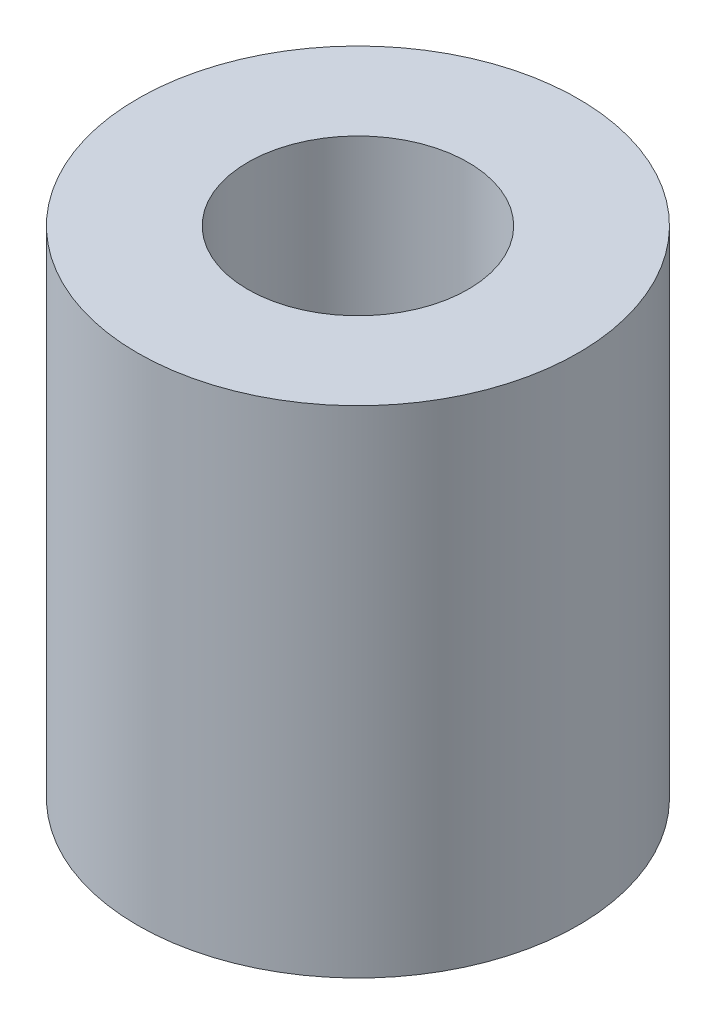
ISO-10303-21;
HEADER;
FILE_DESCRIPTION(('STEP AP214'),'2;1');
FILE_NAME('part.step','',(''),(''),'','','');
FILE_SCHEMA(('AUTOMOTIVE_DESIGN { 1 0 10303 214 1 1 1 1 }'));
ENDSEC;
DATA;
#1=APPLICATION_CONTEXT('core data for automotive mechanical design processes');
#2=APPLICATION_PROTOCOL_DEFINITION('international standard','automotive_design',2000,#1);
#3=PRODUCT_CONTEXT('',#1,'mechanical');
#4=PRODUCT('Part','Part','',(#3));
#5=PRODUCT_RELATED_PRODUCT_CATEGORY('part','',(#4));
#6=PRODUCT_DEFINITION_FORMATION('','',#4);
#7=PRODUCT_DEFINITION_CONTEXT('part definition',#1,'design');
#8=PRODUCT_DEFINITION('design','',#6,#7);
#9=PRODUCT_DEFINITION_SHAPE('','',#8);
#10=(LENGTH_UNIT() NAMED_UNIT(*) SI_UNIT(.MILLI.,.METRE.));
#11=(NAMED_UNIT(*) PLANE_ANGLE_UNIT() SI_UNIT($,.RADIAN.));
#12=(NAMED_UNIT(*) SI_UNIT($,.STERADIAN.) SOLID_ANGLE_UNIT());
#13=UNCERTAINTY_MEASURE_WITH_UNIT(LENGTH_MEASURE(1.E-05),#10,'distance_accuracy_value','');
#14=(GEOMETRIC_REPRESENTATION_CONTEXT(3) GLOBAL_UNCERTAINTY_ASSIGNED_CONTEXT((#13)) GLOBAL_UNIT_ASSIGNED_CONTEXT((#10,
#11,#12)) REPRESENTATION_CONTEXT('',''));
#15=CARTESIAN_POINT('',(0.,0.,0.));
#16=DIRECTION('',(0.,0.,1.));
#17=DIRECTION('',(1.,0.,0.));
#18=AXIS2_PLACEMENT_3D('',#15,#16,#17);
#19=CARTESIAN_POINT('',(0.,14.2875,0.));
#20=DIRECTION('',(0.,-1.,0.));
#21=DIRECTION('',(0.,0.,-1.));
#22=AXIS2_PLACEMENT_3D('',#19,#20,#21);
#23=CYLINDRICAL_SURFACE('',#22,6.35);
#24=CARTESIAN_POINT('',(0.,14.2875,0.));
#25=DIRECTION('',(0.,1.,0.));
#26=DIRECTION('',(0.,0.,1.));
#27=AXIS2_PLACEMENT_3D('',#24,#25,#26);
#28=CIRCLE('',#27,6.35);
#29=CARTESIAN_POINT('',(0.,14.2875,6.35));
#30=VERTEX_POINT('',#29);
#31=EDGE_CURVE('E10',#30,#30,#28,.T.);
#32=ORIENTED_EDGE('',*,*,#31,.F.);
#33=EDGE_LOOP('',(#32));
#34=FACE_BOUND('',#33,.T.);
#35=CARTESIAN_POINT('',(0.,0.,0.));
#36=DIRECTION('',(0.,1.,0.));
#37=DIRECTION('',(0.,0.,1.));
#38=AXIS2_PLACEMENT_3D('',#35,#36,#37);
#39=CIRCLE('',#38,6.35);
#40=CARTESIAN_POINT('',(0.,0.,6.35));
#41=VERTEX_POINT('',#40);
#42=EDGE_CURVE('E45',#41,#41,#39,.T.);
#43=ORIENTED_EDGE('',*,*,#42,.T.);
#44=EDGE_LOOP('',(#43));
#45=FACE_BOUND('',#44,.T.);
#46=ADVANCED_FACE('F37',(#34,#45),#23,.T.);
#47=CARTESIAN_POINT('',(0.,14.2875,0.));
#48=DIRECTION('',(0.,1.,0.));
#49=DIRECTION('',(0.,0.,1.));
#50=AXIS2_PLACEMENT_3D('',#47,#48,#49);
#51=PLANE('',#50);
#52=CARTESIAN_POINT('',(0.,14.2875,0.));
#53=DIRECTION('',(0.,1.,0.));
#54=DIRECTION('',(0.,0.,1.));
#55=AXIS2_PLACEMENT_3D('',#52,#53,#54);
#56=CIRCLE('',#55,3.175);
#57=CARTESIAN_POINT('',(0.,14.2875,3.175));
#58=VERTEX_POINT('',#57);
#59=EDGE_CURVE('E52',#58,#58,#56,.T.);
#60=ORIENTED_EDGE('',*,*,#59,.F.);
#61=EDGE_LOOP('',(#60));
#62=FACE_BOUND('',#61,.T.);
#63=ORIENTED_EDGE('',*,*,#31,.T.);
#64=EDGE_LOOP('',(#63));
#65=FACE_BOUND('',#64,.T.);
#66=ADVANCED_FACE('F70',(#62,#65),#51,.T.);
#67=CARTESIAN_POINT('',(0.,0.,0.));
#68=DIRECTION('',(0.,1.,0.));
#69=DIRECTION('',(0.,0.,1.));
#70=AXIS2_PLACEMENT_3D('',#67,#68,#69);
#71=PLANE('',#70);
#72=CARTESIAN_POINT('',(0.,0.,0.));
#73=DIRECTION('',(0.,1.,0.));
#74=DIRECTION('',(0.,0.,1.));
#75=AXIS2_PLACEMENT_3D('',#72,#73,#74);
#76=CIRCLE('',#75,3.175);
#77=CARTESIAN_POINT('',(0.,0.,3.175));
#78=VERTEX_POINT('',#77);
#79=EDGE_CURVE('E40',#78,#78,#76,.T.);
#80=ORIENTED_EDGE('',*,*,#79,.T.);
#81=EDGE_LOOP('',(#80));
#82=FACE_BOUND('',#81,.T.);
#83=ORIENTED_EDGE('',*,*,#42,.F.);
#84=EDGE_LOOP('',(#83));
#85=FACE_BOUND('',#84,.T.);
#86=ADVANCED_FACE('F61',(#82,#85),#71,.F.);
#87=CARTESIAN_POINT('',(0.,-3.175,0.));
#88=DIRECTION('',(0.,1.,0.));
#89=DIRECTION('',(0.,0.,1.));
#90=AXIS2_PLACEMENT_3D('',#87,#88,#89);
#91=CYLINDRICAL_SURFACE('',#90,3.175);
#92=ORIENTED_EDGE('',*,*,#59,.T.);
#93=EDGE_LOOP('',(#92));
#94=FACE_BOUND('',#93,.T.);
#95=ORIENTED_EDGE('',*,*,#79,.F.);
#96=EDGE_LOOP('',(#95));
#97=FACE_BOUND('',#96,.T.);
#98=ADVANCED_FACE('F64',(#94,#97),#91,.F.);
#99=CLOSED_SHELL('',(#46,#66,#86,#98));
#100=MANIFOLD_SOLID_BREP('B2',#99);
#101=ADVANCED_BREP_SHAPE_REPRESENTATION('',(#18,#100),#14);
#102=SHAPE_DEFINITION_REPRESENTATION(#9,#101);
ENDSEC;
END-ISO-10303-21;
